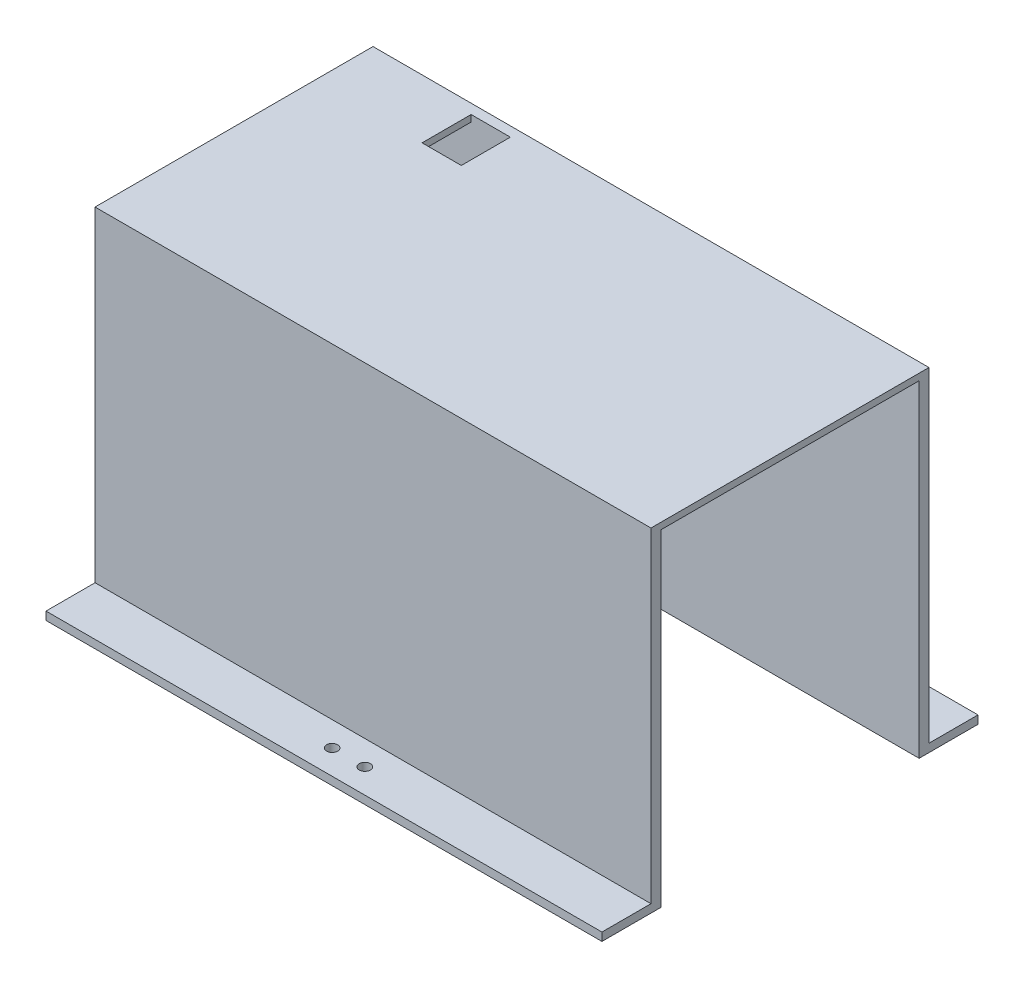
ISO-10303-21;
HEADER;
FILE_DESCRIPTION(('STEP AP214'),'2;1');
FILE_NAME('part.step','',(''),(''),'','','');
FILE_SCHEMA(('AUTOMOTIVE_DESIGN { 1 0 10303 214 1 1 1 1 }'));
ENDSEC;
DATA;
#1=APPLICATION_CONTEXT('core data for automotive mechanical design processes');
#2=APPLICATION_PROTOCOL_DEFINITION('international standard','automotive_design',2000,#1);
#3=PRODUCT_CONTEXT('',#1,'mechanical');
#4=PRODUCT('Part','Part','',(#3));
#5=PRODUCT_RELATED_PRODUCT_CATEGORY('part','',(#4));
#6=PRODUCT_DEFINITION_FORMATION('','',#4);
#7=PRODUCT_DEFINITION_CONTEXT('part definition',#1,'design');
#8=PRODUCT_DEFINITION('design','',#6,#7);
#9=PRODUCT_DEFINITION_SHAPE('','',#8);
#10=(LENGTH_UNIT() NAMED_UNIT(*) SI_UNIT(.MILLI.,.METRE.));
#11=(NAMED_UNIT(*) PLANE_ANGLE_UNIT() SI_UNIT($,.RADIAN.));
#12=(NAMED_UNIT(*) SI_UNIT($,.STERADIAN.) SOLID_ANGLE_UNIT());
#13=UNCERTAINTY_MEASURE_WITH_UNIT(LENGTH_MEASURE(1.E-05),#10,'distance_accuracy_value','');
#14=(GEOMETRIC_REPRESENTATION_CONTEXT(3) GLOBAL_UNCERTAINTY_ASSIGNED_CONTEXT((#13)) GLOBAL_UNIT_ASSIGNED_CONTEXT((#10,
#11,#12)) REPRESENTATION_CONTEXT('',''));
#15=CARTESIAN_POINT('',(0.,0.,0.));
#16=DIRECTION('',(0.,0.,1.));
#17=DIRECTION('',(1.,0.,0.));
#18=AXIS2_PLACEMENT_3D('',#15,#16,#17);
#19=CARTESIAN_POINT('',(-74.5991561181434,2.,45.5485232067511));
#20=DIRECTION('',(0.,0.,-1.));
#21=DIRECTION('',(-1.,0.,0.));
#22=AXIS2_PLACEMENT_3D('',#19,#20,#21);
#23=PLANE('',#22);
#24=DIRECTION('',(-1.,0.,0.));
#25=VECTOR('',#24,1.);
#26=CARTESIAN_POINT('',(-74.5991561181434,-97.5,45.5485232067511));
#27=LINE('',#26,#25);
#28=CARTESIAN_POINT('',(95.4008438818566,-97.5,45.5485232067511));
#29=VERTEX_POINT('',#28);
#30=CARTESIAN_POINT('',(-74.5991561181434,-97.5,45.5485232067511));
#31=VERTEX_POINT('',#30);
#32=EDGE_CURVE('E57',#29,#31,#27,.T.);
#33=ORIENTED_EDGE('',*,*,#32,.F.);
#34=DIRECTION('',(0.,-1.,0.));
#35=VECTOR('',#34,1.);
#36=CARTESIAN_POINT('',(95.4008438818566,2.,45.5485232067511));
#37=LINE('',#36,#35);
#38=CARTESIAN_POINT('',(95.4008438818566,2.,45.5485232067511));
#39=VERTEX_POINT('',#38);
#40=EDGE_CURVE('E278',#39,#29,#37,.T.);
#41=ORIENTED_EDGE('',*,*,#40,.F.);
#42=DIRECTION('',(1.,0.,0.));
#43=VECTOR('',#42,1.);
#44=CARTESIAN_POINT('',(-74.5991561181434,2.,45.5485232067511));
#45=LINE('',#44,#43);
#46=CARTESIAN_POINT('',(-74.5991561181434,2.,45.5485232067511));
#47=VERTEX_POINT('',#46);
#48=EDGE_CURVE('E270',#47,#39,#45,.T.);
#49=ORIENTED_EDGE('',*,*,#48,.F.);
#50=DIRECTION('',(0.,-1.,0.));
#51=VECTOR('',#50,1.);
#52=CARTESIAN_POINT('',(-74.5991561181434,2.,45.5485232067511));
#53=LINE('',#52,#51);
#54=EDGE_CURVE('E43',#47,#31,#53,.T.);
#55=ORIENTED_EDGE('',*,*,#54,.T.);
#56=EDGE_LOOP('',(#33,#41,#49,#55));
#57=FACE_BOUND('',#56,.T.);
#58=ADVANCED_FACE('F39',(#57),#23,.F.);
#59=CARTESIAN_POINT('',(-74.5991561181434,2.,-39.4514767932489));
#60=DIRECTION('',(0.,0.,1.));
#61=DIRECTION('',(1.,0.,0.));
#62=AXIS2_PLACEMENT_3D('',#59,#60,#61);
#63=PLANE('',#62);
#64=DIRECTION('',(1.,0.,0.));
#65=VECTOR('',#64,1.);
#66=CARTESIAN_POINT('',(95.4008438818566,-97.5,-39.4514767932489));
#67=LINE('',#66,#65);
#68=CARTESIAN_POINT('',(-74.5991561181434,-97.5,-39.4514767932489));
#69=VERTEX_POINT('',#68);
#70=CARTESIAN_POINT('',(95.4008438818566,-97.5,-39.4514767932489));
#71=VERTEX_POINT('',#70);
#72=EDGE_CURVE('E63',#69,#71,#67,.T.);
#73=ORIENTED_EDGE('',*,*,#72,.F.);
#74=DIRECTION('',(0.,-1.,0.));
#75=VECTOR('',#74,1.);
#76=CARTESIAN_POINT('',(-74.5991561181434,2.,-39.4514767932489));
#77=LINE('',#76,#75);
#78=CARTESIAN_POINT('',(-74.5991561181434,2.,-39.4514767932489));
#79=VERTEX_POINT('',#78);
#80=EDGE_CURVE('E273',#79,#69,#77,.T.);
#81=ORIENTED_EDGE('',*,*,#80,.F.);
#82=DIRECTION('',(-1.,0.,0.));
#83=VECTOR('',#82,1.);
#84=CARTESIAN_POINT('',(-74.5991561181434,2.,-39.4514767932489));
#85=LINE('',#84,#83);
#86=CARTESIAN_POINT('',(95.4008438818566,2.,-39.4514767932489));
#87=VERTEX_POINT('',#86);
#88=EDGE_CURVE('E275',#87,#79,#85,.T.);
#89=ORIENTED_EDGE('',*,*,#88,.F.);
#90=DIRECTION('',(0.,-1.,0.));
#91=VECTOR('',#90,1.);
#92=CARTESIAN_POINT('',(95.4008438818566,2.,-39.4514767932489));
#93=LINE('',#92,#91);
#94=EDGE_CURVE('E276',#87,#71,#93,.T.);
#95=ORIENTED_EDGE('',*,*,#94,.T.);
#96=EDGE_LOOP('',(#73,#81,#89,#95));
#97=FACE_BOUND('',#96,.T.);
#98=ADVANCED_FACE('F330',(#97),#63,.F.);
#99=CARTESIAN_POINT('',(0.,0.,0.));
#100=DIRECTION('',(0.,1.,0.));
#101=DIRECTION('',(0.,0.,1.));
#102=AXIS2_PLACEMENT_3D('',#99,#100,#101);
#103=PLANE('',#102);
#104=DIRECTION('',(-1.,0.,0.));
#105=VECTOR('',#104,1.);
#106=CARTESIAN_POINT('',(-74.5991561181434,0.,-36.4514767932489));
#107=LINE('',#106,#105);
#108=CARTESIAN_POINT('',(95.4008438818566,0.,-36.4514767932489));
#109=VERTEX_POINT('',#108);
#110=CARTESIAN_POINT('',(-29.5991561181434,0.,-36.4514767932489));
#111=VERTEX_POINT('',#110);
#112=EDGE_CURVE('E47',#109,#111,#107,.T.);
#113=ORIENTED_EDGE('',*,*,#112,.F.);
#114=DIRECTION('',(0.,0.,-1.));
#115=VECTOR('',#114,1.);
#116=CARTESIAN_POINT('',(95.4008438818566,0.,-39.4514767932489));
#117=LINE('',#116,#115);
#118=CARTESIAN_POINT('',(95.4008438818566,0.,42.5485232067511));
#119=VERTEX_POINT('',#118);
#120=EDGE_CURVE('E268',#119,#109,#117,.T.);
#121=ORIENTED_EDGE('',*,*,#120,.F.);
#122=DIRECTION('',(1.,0.,0.));
#123=VECTOR('',#122,1.);
#124=CARTESIAN_POINT('',(-74.5991561181434,0.,42.5485232067511));
#125=LINE('',#124,#123);
#126=CARTESIAN_POINT('',(-74.5991561181434,0.,42.5485232067511));
#127=VERTEX_POINT('',#126);
#128=EDGE_CURVE('E167',#127,#119,#125,.T.);
#129=ORIENTED_EDGE('',*,*,#128,.F.);
#130=DIRECTION('',(0.,0.,1.));
#131=VECTOR('',#130,1.);
#132=CARTESIAN_POINT('',(-74.5991561181434,0.,-39.4514767932489));
#133=LINE('',#132,#131);
#134=CARTESIAN_POINT('',(-74.5991561181434,0.,-36.4514767932489));
#135=VERTEX_POINT('',#134);
#136=EDGE_CURVE('E260',#135,#127,#133,.T.);
#137=ORIENTED_EDGE('',*,*,#136,.F.);
#138=CARTESIAN_POINT('',(-41.5991561181434,0.,-36.4514767932489));
#139=VERTEX_POINT('',#138);
#140=EDGE_CURVE('E11',#139,#135,#107,.T.);
#141=ORIENTED_EDGE('',*,*,#140,.F.);
#142=DIRECTION('',(0.,0.,1.));
#143=VECTOR('',#142,1.);
#144=CARTESIAN_POINT('',(-41.5991561181434,0.,-36.4514767932489));
#145=LINE('',#144,#143);
#146=CARTESIAN_POINT('',(-41.5991561181434,0.,-21.4514767932489));
#147=VERTEX_POINT('',#146);
#148=EDGE_CURVE('E234',#139,#147,#145,.T.);
#149=ORIENTED_EDGE('',*,*,#148,.T.);
#150=DIRECTION('',(1.,0.,0.));
#151=VECTOR('',#150,1.);
#152=CARTESIAN_POINT('',(-41.5991561181434,0.,-21.4514767932489));
#153=LINE('',#152,#151);
#154=CARTESIAN_POINT('',(-29.5991561181434,0.,-21.4514767932489));
#155=VERTEX_POINT('',#154);
#156=EDGE_CURVE('E236',#147,#155,#153,.T.);
#157=ORIENTED_EDGE('',*,*,#156,.T.);
#158=DIRECTION('',(0.,0.,-1.));
#159=VECTOR('',#158,1.);
#160=CARTESIAN_POINT('',(-29.5991561181434,0.,-36.4514767932489));
#161=LINE('',#160,#159);
#162=EDGE_CURVE('E245',#155,#111,#161,.T.);
#163=ORIENTED_EDGE('',*,*,#162,.T.);
#164=EDGE_LOOP('',(#113,#121,#129,#137,#141,#149,#157,#163));
#165=FACE_BOUND('',#164,.T.);
#166=ADVANCED_FACE('F294',(#165),#103,.F.);
#167=CARTESIAN_POINT('',(-74.5991561181434,2.,-39.4514767932489));
#168=DIRECTION('',(1.,0.,0.));
#169=DIRECTION('',(0.,0.,-1.));
#170=AXIS2_PLACEMENT_3D('',#167,#168,#169);
#171=PLANE('',#170);
#172=ORIENTED_EDGE('',*,*,#80,.T.);
#173=DIRECTION('',(0.,0.,1.));
#174=VECTOR('',#173,1.);
#175=CARTESIAN_POINT('',(-74.5991561181434,-97.5,-54.4514767932489));
#176=LINE('',#175,#174);
#177=CARTESIAN_POINT('',(-74.5991561181434,-97.5,-54.4514767932489));
#178=VERTEX_POINT('',#177);
#179=EDGE_CURVE('E209',#178,#69,#176,.T.);
#180=ORIENTED_EDGE('',*,*,#179,.F.);
#181=DIRECTION('',(0.,1.,0.));
#182=VECTOR('',#181,1.);
#183=CARTESIAN_POINT('',(-74.5991561181434,-100.,-54.4514767932489));
#184=LINE('',#183,#182);
#185=CARTESIAN_POINT('',(-74.5991561181434,-100.,-54.4514767932489));
#186=VERTEX_POINT('',#185);
#187=EDGE_CURVE('E205',#186,#178,#184,.T.);
#188=ORIENTED_EDGE('',*,*,#187,.F.);
#189=DIRECTION('',(0.,0.,-1.));
#190=VECTOR('',#189,1.);
#191=CARTESIAN_POINT('',(-74.5991561181434,-100.,-39.4514767932489));
#192=LINE('',#191,#190);
#193=CARTESIAN_POINT('',(-74.5991561181434,-100.,-36.4514767932489));
#194=VERTEX_POINT('',#193);
#195=EDGE_CURVE('E213',#194,#186,#192,.T.);
#196=ORIENTED_EDGE('',*,*,#195,.F.);
#197=DIRECTION('',(0.,1.,0.));
#198=VECTOR('',#197,1.);
#199=CARTESIAN_POINT('',(-74.5991561181434,-100.,-36.4514767932489));
#200=LINE('',#199,#198);
#201=EDGE_CURVE('E217',#194,#135,#200,.T.);
#202=ORIENTED_EDGE('',*,*,#201,.T.);
#203=ORIENTED_EDGE('',*,*,#136,.T.);
#204=DIRECTION('',(0.,1.,0.));
#205=VECTOR('',#204,1.);
#206=CARTESIAN_POINT('',(-74.5991561181434,-100.,42.5485232067511));
#207=LINE('',#206,#205);
#208=CARTESIAN_POINT('',(-74.5991561181434,-100.,42.5485232067511));
#209=VERTEX_POINT('',#208);
#210=EDGE_CURVE('E163',#209,#127,#207,.T.);
#211=ORIENTED_EDGE('',*,*,#210,.F.);
#212=DIRECTION('',(0.,0.,-1.));
#213=VECTOR('',#212,1.);
#214=CARTESIAN_POINT('',(-74.5991561181434,-100.,45.5485232067511));
#215=LINE('',#214,#213);
#216=CARTESIAN_POINT('',(-74.5991561181434,-100.,60.5485232067511));
#217=VERTEX_POINT('',#216);
#218=EDGE_CURVE('E160',#217,#209,#215,.T.);
#219=ORIENTED_EDGE('',*,*,#218,.F.);
#220=DIRECTION('',(0.,-1.,0.));
#221=VECTOR('',#220,1.);
#222=CARTESIAN_POINT('',(-74.5991561181434,-100.,60.5485232067511));
#223=LINE('',#222,#221);
#224=CARTESIAN_POINT('',(-74.5991561181434,-97.5,60.5485232067511));
#225=VERTEX_POINT('',#224);
#226=EDGE_CURVE('E161',#225,#217,#223,.T.);
#227=ORIENTED_EDGE('',*,*,#226,.F.);
#228=DIRECTION('',(0.,0.,-1.));
#229=VECTOR('',#228,1.);
#230=CARTESIAN_POINT('',(-74.5991561181434,-97.5,60.5485232067511));
#231=LINE('',#230,#229);
#232=EDGE_CURVE('E189',#225,#31,#231,.T.);
#233=ORIENTED_EDGE('',*,*,#232,.T.);
#234=ORIENTED_EDGE('',*,*,#54,.F.);
#235=DIRECTION('',(0.,0.,1.));
#236=VECTOR('',#235,1.);
#237=CARTESIAN_POINT('',(-74.5991561181434,2.,-39.4514767932489));
#238=LINE('',#237,#236);
#239=EDGE_CURVE('E262',#79,#47,#238,.T.);
#240=ORIENTED_EDGE('',*,*,#239,.F.);
#241=EDGE_LOOP('',(#172,#180,#188,#196,#202,#203,#211,#219,#227,#233,#234,#240));
#242=FACE_BOUND('',#241,.T.);
#243=ADVANCED_FACE('F41',(#242),#171,.F.);
#244=CARTESIAN_POINT('',(95.4008438818566,2.,-39.4514767932489));
#245=DIRECTION('',(-1.,0.,0.));
#246=DIRECTION('',(0.,0.,1.));
#247=AXIS2_PLACEMENT_3D('',#244,#245,#246);
#248=PLANE('',#247);
#249=ORIENTED_EDGE('',*,*,#40,.T.);
#250=DIRECTION('',(0.,0.,-1.));
#251=VECTOR('',#250,1.);
#252=CARTESIAN_POINT('',(95.4008438818566,-97.5,60.5485232067511));
#253=LINE('',#252,#251);
#254=CARTESIAN_POINT('',(95.4008438818566,-97.5,60.5485232067511));
#255=VERTEX_POINT('',#254);
#256=EDGE_CURVE('E192',#255,#29,#253,.T.);
#257=ORIENTED_EDGE('',*,*,#256,.F.);
#258=DIRECTION('',(0.,1.,0.));
#259=VECTOR('',#258,1.);
#260=CARTESIAN_POINT('',(95.4008438818566,-100.,60.5485232067511));
#261=LINE('',#260,#259);
#262=CARTESIAN_POINT('',(95.4008438818566,-100.,60.5485232067511));
#263=VERTEX_POINT('',#262);
#264=EDGE_CURVE('E176',#263,#255,#261,.T.);
#265=ORIENTED_EDGE('',*,*,#264,.F.);
#266=DIRECTION('',(0.,0.,1.));
#267=VECTOR('',#266,1.);
#268=CARTESIAN_POINT('',(95.4008438818566,-100.,45.5485232067511));
#269=LINE('',#268,#267);
#270=CARTESIAN_POINT('',(95.4008438818566,-100.,42.5485232067511));
#271=VERTEX_POINT('',#270);
#272=EDGE_CURVE('E172',#271,#263,#269,.T.);
#273=ORIENTED_EDGE('',*,*,#272,.F.);
#274=DIRECTION('',(0.,1.,0.));
#275=VECTOR('',#274,1.);
#276=CARTESIAN_POINT('',(95.4008438818566,-100.,42.5485232067511));
#277=LINE('',#276,#275);
#278=EDGE_CURVE('E227',#271,#119,#277,.T.);
#279=ORIENTED_EDGE('',*,*,#278,.T.);
#280=ORIENTED_EDGE('',*,*,#120,.T.);
#281=DIRECTION('',(0.,1.,0.));
#282=VECTOR('',#281,1.);
#283=CARTESIAN_POINT('',(95.4008438818566,-100.,-36.4514767932489));
#284=LINE('',#283,#282);
#285=CARTESIAN_POINT('',(95.4008438818566,-100.,-36.4514767932489));
#286=VERTEX_POINT('',#285);
#287=EDGE_CURVE('E224',#286,#109,#284,.T.);
#288=ORIENTED_EDGE('',*,*,#287,.F.);
#289=DIRECTION('',(0.,0.,1.));
#290=VECTOR('',#289,1.);
#291=CARTESIAN_POINT('',(95.4008438818566,-100.,-39.4514767932489));
#292=LINE('',#291,#290);
#293=CARTESIAN_POINT('',(95.4008438818566,-100.,-54.4514767932489));
#294=VERTEX_POINT('',#293);
#295=EDGE_CURVE('E214',#294,#286,#292,.T.);
#296=ORIENTED_EDGE('',*,*,#295,.F.);
#297=DIRECTION('',(0.,-1.,0.));
#298=VECTOR('',#297,1.);
#299=CARTESIAN_POINT('',(95.4008438818566,-100.,-54.4514767932489));
#300=LINE('',#299,#298);
#301=CARTESIAN_POINT('',(95.4008438818566,-97.5,-54.4514767932489));
#302=VERTEX_POINT('',#301);
#303=EDGE_CURVE('E198',#302,#294,#300,.T.);
#304=ORIENTED_EDGE('',*,*,#303,.F.);
#305=DIRECTION('',(0.,0.,1.));
#306=VECTOR('',#305,1.);
#307=CARTESIAN_POINT('',(95.4008438818566,-97.5,-54.4514767932489));
#308=LINE('',#307,#306);
#309=EDGE_CURVE('E206',#302,#71,#308,.T.);
#310=ORIENTED_EDGE('',*,*,#309,.T.);
#311=ORIENTED_EDGE('',*,*,#94,.F.);
#312=DIRECTION('',(0.,0.,-1.));
#313=VECTOR('',#312,1.);
#314=CARTESIAN_POINT('',(95.4008438818566,2.,-39.4514767932489));
#315=LINE('',#314,#313);
#316=EDGE_CURVE('E269',#39,#87,#315,.T.);
#317=ORIENTED_EDGE('',*,*,#316,.F.);
#318=EDGE_LOOP('',(#249,#257,#265,#273,#279,#280,#288,#296,#304,#310,#311,#317));
#319=FACE_BOUND('',#318,.T.);
#320=ADVANCED_FACE('F287',(#319),#248,.F.);
#321=CARTESIAN_POINT('',(0.,2.,0.));
#322=DIRECTION('',(0.,1.,0.));
#323=DIRECTION('',(0.,0.,1.));
#324=AXIS2_PLACEMENT_3D('',#321,#322,#323);
#325=PLANE('',#324);
#326=DIRECTION('',(-1.,0.,0.));
#327=VECTOR('',#326,1.);
#328=CARTESIAN_POINT('',(-41.5991561181434,2.,-36.4514767932489));
#329=LINE('',#328,#327);
#330=CARTESIAN_POINT('',(-29.5991561181434,2.,-36.4514767932489));
#331=VERTEX_POINT('',#330);
#332=CARTESIAN_POINT('',(-41.5991561181434,2.,-36.4514767932489));
#333=VERTEX_POINT('',#332);
#334=EDGE_CURVE('E226',#331,#333,#329,.T.);
#335=ORIENTED_EDGE('',*,*,#334,.F.);
#336=DIRECTION('',(0.,0.,-1.));
#337=VECTOR('',#336,1.);
#338=CARTESIAN_POINT('',(-29.5991561181434,2.,-36.4514767932489));
#339=LINE('',#338,#337);
#340=CARTESIAN_POINT('',(-29.5991561181434,2.,-21.4514767932489));
#341=VERTEX_POINT('',#340);
#342=EDGE_CURVE('E239',#341,#331,#339,.T.);
#343=ORIENTED_EDGE('',*,*,#342,.F.);
#344=DIRECTION('',(1.,0.,0.));
#345=VECTOR('',#344,1.);
#346=CARTESIAN_POINT('',(-41.5991561181434,2.,-21.4514767932489));
#347=LINE('',#346,#345);
#348=CARTESIAN_POINT('',(-41.5991561181434,2.,-21.4514767932489));
#349=VERTEX_POINT('',#348);
#350=EDGE_CURVE('E249',#349,#341,#347,.T.);
#351=ORIENTED_EDGE('',*,*,#350,.F.);
#352=DIRECTION('',(0.,0.,1.));
#353=VECTOR('',#352,1.);
#354=CARTESIAN_POINT('',(-41.5991561181434,2.,-36.4514767932489));
#355=LINE('',#354,#353);
#356=EDGE_CURVE('E250',#333,#349,#355,.T.);
#357=ORIENTED_EDGE('',*,*,#356,.F.);
#358=EDGE_LOOP('',(#335,#343,#351,#357));
#359=FACE_BOUND('',#358,.T.);
#360=ORIENTED_EDGE('',*,*,#239,.T.);
#361=ORIENTED_EDGE('',*,*,#48,.T.);
#362=ORIENTED_EDGE('',*,*,#316,.T.);
#363=ORIENTED_EDGE('',*,*,#88,.T.);
#364=EDGE_LOOP('',(#360,#361,#362,#363));
#365=FACE_BOUND('',#364,.T.);
#366=ADVANCED_FACE('F328',(#359,#365),#325,.T.);
#367=CARTESIAN_POINT('',(-41.5991561181434,0.,-36.4514767932489));
#368=DIRECTION('',(0.,0.,-1.));
#369=DIRECTION('',(-1.,0.,0.));
#370=AXIS2_PLACEMENT_3D('',#367,#368,#369);
#371=PLANE('',#370);
#372=ORIENTED_EDGE('',*,*,#334,.T.);
#373=DIRECTION('',(0.,1.,0.));
#374=VECTOR('',#373,1.);
#375=CARTESIAN_POINT('',(-41.5991561181434,0.,-36.4514767932489));
#376=LINE('',#375,#374);
#377=EDGE_CURVE('E244',#139,#333,#376,.T.);
#378=ORIENTED_EDGE('',*,*,#377,.F.);
#379=ORIENTED_EDGE('',*,*,#140,.T.);
#380=ORIENTED_EDGE('',*,*,#201,.F.);
#381=DIRECTION('',(-1.,0.,0.));
#382=VECTOR('',#381,1.);
#383=CARTESIAN_POINT('',(-74.5991561181434,-100.,-36.4514767932489));
#384=LINE('',#383,#382);
#385=EDGE_CURVE('E220',#286,#194,#384,.T.);
#386=ORIENTED_EDGE('',*,*,#385,.F.);
#387=ORIENTED_EDGE('',*,*,#287,.T.);
#388=ORIENTED_EDGE('',*,*,#112,.T.);
#389=DIRECTION('',(0.,1.,0.));
#390=VECTOR('',#389,1.);
#391=CARTESIAN_POINT('',(-29.5991561181434,0.,-36.4514767932489));
#392=LINE('',#391,#390);
#393=EDGE_CURVE('E254',#111,#331,#392,.T.);
#394=ORIENTED_EDGE('',*,*,#393,.T.);
#395=EDGE_LOOP('',(#372,#378,#379,#380,#386,#387,#388,#394));
#396=FACE_BOUND('',#395,.T.);
#397=ADVANCED_FACE('F299',(#396),#371,.F.);
#398=CARTESIAN_POINT('',(-29.5991561181434,0.,-36.4514767932489));
#399=DIRECTION('',(1.,0.,0.));
#400=DIRECTION('',(0.,0.,-1.));
#401=AXIS2_PLACEMENT_3D('',#398,#399,#400);
#402=PLANE('',#401);
#403=ORIENTED_EDGE('',*,*,#342,.T.);
#404=ORIENTED_EDGE('',*,*,#393,.F.);
#405=ORIENTED_EDGE('',*,*,#162,.F.);
#406=DIRECTION('',(0.,1.,0.));
#407=VECTOR('',#406,1.);
#408=CARTESIAN_POINT('',(-29.5991561181434,0.,-21.4514767932489));
#409=LINE('',#408,#407);
#410=EDGE_CURVE('E256',#155,#341,#409,.T.);
#411=ORIENTED_EDGE('',*,*,#410,.T.);
#412=EDGE_LOOP('',(#403,#404,#405,#411));
#413=FACE_BOUND('',#412,.T.);
#414=ADVANCED_FACE('F311',(#413),#402,.F.);
#415=CARTESIAN_POINT('',(-41.5991561181434,0.,-21.4514767932489));
#416=DIRECTION('',(0.,0.,1.));
#417=DIRECTION('',(1.,0.,0.));
#418=AXIS2_PLACEMENT_3D('',#415,#416,#417);
#419=PLANE('',#418);
#420=ORIENTED_EDGE('',*,*,#350,.T.);
#421=ORIENTED_EDGE('',*,*,#410,.F.);
#422=ORIENTED_EDGE('',*,*,#156,.F.);
#423=DIRECTION('',(0.,1.,0.));
#424=VECTOR('',#423,1.);
#425=CARTESIAN_POINT('',(-41.5991561181434,0.,-21.4514767932489));
#426=LINE('',#425,#424);
#427=EDGE_CURVE('E257',#147,#349,#426,.T.);
#428=ORIENTED_EDGE('',*,*,#427,.T.);
#429=EDGE_LOOP('',(#420,#421,#422,#428));
#430=FACE_BOUND('',#429,.T.);
#431=ADVANCED_FACE('F310',(#430),#419,.F.);
#432=CARTESIAN_POINT('',(-41.5991561181434,0.,-36.4514767932489));
#433=DIRECTION('',(-1.,0.,0.));
#434=DIRECTION('',(0.,0.,1.));
#435=AXIS2_PLACEMENT_3D('',#432,#433,#434);
#436=PLANE('',#435);
#437=ORIENTED_EDGE('',*,*,#356,.T.);
#438=ORIENTED_EDGE('',*,*,#427,.F.);
#439=ORIENTED_EDGE('',*,*,#148,.F.);
#440=ORIENTED_EDGE('',*,*,#377,.T.);
#441=EDGE_LOOP('',(#437,#438,#439,#440));
#442=FACE_BOUND('',#441,.T.);
#443=ADVANCED_FACE('F304',(#442),#436,.F.);
#444=CARTESIAN_POINT('',(-74.5991561181434,-100.,42.5485232067511));
#445=DIRECTION('',(0.,0.,1.));
#446=DIRECTION('',(1.,0.,0.));
#447=AXIS2_PLACEMENT_3D('',#444,#445,#446);
#448=PLANE('',#447);
#449=ORIENTED_EDGE('',*,*,#128,.T.);
#450=ORIENTED_EDGE('',*,*,#278,.F.);
#451=DIRECTION('',(1.,0.,0.));
#452=VECTOR('',#451,1.);
#453=CARTESIAN_POINT('',(-74.5991561181434,-100.,42.5485232067511));
#454=LINE('',#453,#452);
#455=EDGE_CURVE('E170',#209,#271,#454,.T.);
#456=ORIENTED_EDGE('',*,*,#455,.F.);
#457=ORIENTED_EDGE('',*,*,#210,.T.);
#458=EDGE_LOOP('',(#449,#450,#456,#457));
#459=FACE_BOUND('',#458,.T.);
#460=ADVANCED_FACE('F295',(#459),#448,.F.);
#461=CARTESIAN_POINT('',(0.,-100.,0.));
#462=DIRECTION('',(0.,-1.,0.));
#463=DIRECTION('',(0.,0.,-1.));
#464=AXIS2_PLACEMENT_3D('',#461,#462,#463);
#465=PLANE('',#464);
#466=CARTESIAN_POINT('',(5.40084388185659,-100.,53.0485232067511));
#467=DIRECTION('',(0.,1.,0.));
#468=DIRECTION('',(0.,0.,1.));
#469=AXIS2_PLACEMENT_3D('',#466,#467,#468);
#470=CIRCLE('',#469,1.7);
#471=CARTESIAN_POINT('',(5.40084388185659,-100.,54.7485232067511));
#472=VERTEX_POINT('',#471);
#473=EDGE_CURVE('E181',#472,#472,#470,.T.);
#474=ORIENTED_EDGE('',*,*,#473,.T.);
#475=EDGE_LOOP('',(#474));
#476=FACE_BOUND('',#475,.T.);
#477=CARTESIAN_POINT('',(15.4008438818566,-100.,53.0485232067511));
#478=DIRECTION('',(0.,1.,0.));
#479=DIRECTION('',(0.,0.,1.));
#480=AXIS2_PLACEMENT_3D('',#477,#478,#479);
#481=CIRCLE('',#480,1.7);
#482=CARTESIAN_POINT('',(15.4008438818566,-100.,54.7485232067511));
#483=VERTEX_POINT('',#482);
#484=EDGE_CURVE('E186',#483,#483,#481,.T.);
#485=ORIENTED_EDGE('',*,*,#484,.T.);
#486=EDGE_LOOP('',(#485));
#487=FACE_BOUND('',#486,.T.);
#488=ORIENTED_EDGE('',*,*,#218,.T.);
#489=ORIENTED_EDGE('',*,*,#455,.T.);
#490=ORIENTED_EDGE('',*,*,#272,.T.);
#491=DIRECTION('',(1.,0.,0.));
#492=VECTOR('',#491,1.);
#493=CARTESIAN_POINT('',(-74.5991561181434,-100.,60.5485232067511));
#494=LINE('',#493,#492);
#495=EDGE_CURVE('E168',#217,#263,#494,.T.);
#496=ORIENTED_EDGE('',*,*,#495,.F.);
#497=EDGE_LOOP('',(#488,#489,#490,#496));
#498=FACE_BOUND('',#497,.T.);
#499=ADVANCED_FACE('F171',(#476,#487,#498),#465,.T.);
#500=CARTESIAN_POINT('',(0.,-100.,0.));
#501=DIRECTION('',(0.,1.,0.));
#502=DIRECTION('',(0.,0.,1.));
#503=AXIS2_PLACEMENT_3D('',#500,#501,#502);
#504=PLANE('',#503);
#505=CARTESIAN_POINT('',(5.40084388185656,-100.,-46.9514767932489));
#506=DIRECTION('',(0.,1.,0.));
#507=DIRECTION('',(0.,0.,1.));
#508=AXIS2_PLACEMENT_3D('',#505,#506,#507);
#509=CIRCLE('',#508,1.7);
#510=CARTESIAN_POINT('',(5.40084388185656,-100.,-45.2514767932489));
#511=VERTEX_POINT('',#510);
#512=EDGE_CURVE('E555',#511,#511,#509,.T.);
#513=ORIENTED_EDGE('',*,*,#512,.T.);
#514=EDGE_LOOP('',(#513));
#515=FACE_BOUND('',#514,.T.);
#516=CARTESIAN_POINT('',(15.4008438818566,-100.,-46.9514767932489));
#517=DIRECTION('',(0.,1.,0.));
#518=DIRECTION('',(0.,0.,1.));
#519=AXIS2_PLACEMENT_3D('',#516,#517,#518);
#520=CIRCLE('',#519,1.7);
#521=CARTESIAN_POINT('',(15.4008438818566,-100.,-45.2514767932489));
#522=VERTEX_POINT('',#521);
#523=EDGE_CURVE('E559',#522,#522,#520,.T.);
#524=ORIENTED_EDGE('',*,*,#523,.T.);
#525=EDGE_LOOP('',(#524));
#526=FACE_BOUND('',#525,.T.);
#527=ORIENTED_EDGE('',*,*,#195,.T.);
#528=DIRECTION('',(-1.,0.,0.));
#529=VECTOR('',#528,1.);
#530=CARTESIAN_POINT('',(95.4008438818566,-100.,-54.4514767932489));
#531=LINE('',#530,#529);
#532=EDGE_CURVE('E200',#294,#186,#531,.T.);
#533=ORIENTED_EDGE('',*,*,#532,.F.);
#534=ORIENTED_EDGE('',*,*,#295,.T.);
#535=ORIENTED_EDGE('',*,*,#385,.T.);
#536=EDGE_LOOP('',(#527,#533,#534,#535));
#537=FACE_BOUND('',#536,.T.);
#538=ADVANCED_FACE('F320',(#515,#526,#537),#504,.F.);
#539=CARTESIAN_POINT('',(95.4008438818566,-97.5,-54.4514767932489));
#540=DIRECTION('',(0.,-1.,0.));
#541=DIRECTION('',(0.,0.,-1.));
#542=AXIS2_PLACEMENT_3D('',#539,#540,#541);
#543=PLANE('',#542);
#544=CARTESIAN_POINT('',(5.40084388185656,-97.5,-46.9514767932489));
#545=DIRECTION('',(0.,1.,0.));
#546=DIRECTION('',(0.,0.,1.));
#547=AXIS2_PLACEMENT_3D('',#544,#545,#546);
#548=CIRCLE('',#547,1.7);
#549=CARTESIAN_POINT('',(5.40084388185656,-97.5,-45.2514767932489));
#550=VERTEX_POINT('',#549);
#551=EDGE_CURVE('E553',#550,#550,#548,.T.);
#552=ORIENTED_EDGE('',*,*,#551,.F.);
#553=EDGE_LOOP('',(#552));
#554=FACE_BOUND('',#553,.T.);
#555=CARTESIAN_POINT('',(15.4008438818566,-97.5,-46.9514767932489));
#556=DIRECTION('',(0.,1.,0.));
#557=DIRECTION('',(0.,0.,1.));
#558=AXIS2_PLACEMENT_3D('',#555,#556,#557);
#559=CIRCLE('',#558,1.7);
#560=CARTESIAN_POINT('',(15.4008438818566,-97.5,-45.2514767932489));
#561=VERTEX_POINT('',#560);
#562=EDGE_CURVE('E556',#561,#561,#559,.T.);
#563=ORIENTED_EDGE('',*,*,#562,.F.);
#564=EDGE_LOOP('',(#563));
#565=FACE_BOUND('',#564,.T.);
#566=ORIENTED_EDGE('',*,*,#72,.T.);
#567=ORIENTED_EDGE('',*,*,#309,.F.);
#568=DIRECTION('',(1.,0.,0.));
#569=VECTOR('',#568,1.);
#570=CARTESIAN_POINT('',(95.4008438818566,-97.5,-54.4514767932489));
#571=LINE('',#570,#569);
#572=EDGE_CURVE('E204',#178,#302,#571,.T.);
#573=ORIENTED_EDGE('',*,*,#572,.F.);
#574=ORIENTED_EDGE('',*,*,#179,.T.);
#575=EDGE_LOOP('',(#566,#567,#573,#574));
#576=FACE_BOUND('',#575,.T.);
#577=ADVANCED_FACE('F322',(#554,#565,#576),#543,.F.);
#578=CARTESIAN_POINT('',(0.,0.,-54.4514767932489));
#579=DIRECTION('',(0.,0.,1.));
#580=DIRECTION('',(1.,0.,0.));
#581=AXIS2_PLACEMENT_3D('',#578,#579,#580);
#582=PLANE('',#581);
#583=ORIENTED_EDGE('',*,*,#303,.T.);
#584=ORIENTED_EDGE('',*,*,#532,.T.);
#585=ORIENTED_EDGE('',*,*,#187,.T.);
#586=ORIENTED_EDGE('',*,*,#572,.T.);
#587=EDGE_LOOP('',(#583,#584,#585,#586));
#588=FACE_BOUND('',#587,.T.);
#589=ADVANCED_FACE('F317',(#588),#582,.F.);
#590=CARTESIAN_POINT('',(-74.5991561181434,-97.5,60.5485232067511));
#591=DIRECTION('',(0.,-1.,0.));
#592=DIRECTION('',(0.,0.,-1.));
#593=AXIS2_PLACEMENT_3D('',#590,#591,#592);
#594=PLANE('',#593);
#595=CARTESIAN_POINT('',(5.40084388185659,-97.5,53.0485232067511));
#596=DIRECTION('',(0.,1.,0.));
#597=DIRECTION('',(0.,0.,1.));
#598=AXIS2_PLACEMENT_3D('',#595,#596,#597);
#599=CIRCLE('',#598,1.7);
#600=CARTESIAN_POINT('',(5.40084388185659,-97.5,54.7485232067511));
#601=VERTEX_POINT('',#600);
#602=EDGE_CURVE('E570',#601,#601,#599,.T.);
#603=ORIENTED_EDGE('',*,*,#602,.F.);
#604=EDGE_LOOP('',(#603));
#605=FACE_BOUND('',#604,.T.);
#606=CARTESIAN_POINT('',(15.4008438818566,-97.5,53.0485232067511));
#607=DIRECTION('',(0.,1.,0.));
#608=DIRECTION('',(0.,0.,1.));
#609=AXIS2_PLACEMENT_3D('',#606,#607,#608);
#610=CIRCLE('',#609,1.7);
#611=CARTESIAN_POINT('',(15.4008438818566,-97.5,54.7485232067511));
#612=VERTEX_POINT('',#611);
#613=EDGE_CURVE('E569',#612,#612,#610,.T.);
#614=ORIENTED_EDGE('',*,*,#613,.F.);
#615=EDGE_LOOP('',(#614));
#616=FACE_BOUND('',#615,.T.);
#617=ORIENTED_EDGE('',*,*,#32,.T.);
#618=ORIENTED_EDGE('',*,*,#232,.F.);
#619=DIRECTION('',(-1.,0.,0.));
#620=VECTOR('',#619,1.);
#621=CARTESIAN_POINT('',(-74.5991561181434,-97.5,60.5485232067511));
#622=LINE('',#621,#620);
#623=EDGE_CURVE('E179',#255,#225,#622,.T.);
#624=ORIENTED_EDGE('',*,*,#623,.F.);
#625=ORIENTED_EDGE('',*,*,#256,.T.);
#626=EDGE_LOOP('',(#617,#618,#624,#625));
#627=FACE_BOUND('',#626,.T.);
#628=ADVANCED_FACE('F290',(#605,#616,#627),#594,.F.);
#629=CARTESIAN_POINT('',(0.,0.,60.5485232067511));
#630=DIRECTION('',(0.,0.,-1.));
#631=DIRECTION('',(-1.,0.,0.));
#632=AXIS2_PLACEMENT_3D('',#629,#630,#631);
#633=PLANE('',#632);
#634=ORIENTED_EDGE('',*,*,#226,.T.);
#635=ORIENTED_EDGE('',*,*,#495,.T.);
#636=ORIENTED_EDGE('',*,*,#264,.T.);
#637=ORIENTED_EDGE('',*,*,#623,.T.);
#638=EDGE_LOOP('',(#634,#635,#636,#637));
#639=FACE_BOUND('',#638,.T.);
#640=ADVANCED_FACE('F177',(#639),#633,.F.);
#641=CARTESIAN_POINT('',(15.4008438818566,-100.,53.0485232067511));
#642=DIRECTION('',(0.,1.,0.));
#643=DIRECTION('',(0.,0.,1.));
#644=AXIS2_PLACEMENT_3D('',#641,#642,#643);
#645=CYLINDRICAL_SURFACE('',#644,1.7);
#646=ORIENTED_EDGE('',*,*,#484,.F.);
#647=EDGE_LOOP('',(#646));
#648=FACE_BOUND('',#647,.T.);
#649=ORIENTED_EDGE('',*,*,#613,.T.);
#650=EDGE_LOOP('',(#649));
#651=FACE_BOUND('',#650,.T.);
#652=ADVANCED_FACE('F366',(#648,#651),#645,.F.);
#653=CARTESIAN_POINT('',(5.40084388185659,-100.,53.0485232067511));
#654=DIRECTION('',(0.,1.,0.));
#655=DIRECTION('',(0.,0.,1.));
#656=AXIS2_PLACEMENT_3D('',#653,#654,#655);
#657=CYLINDRICAL_SURFACE('',#656,1.7);
#658=ORIENTED_EDGE('',*,*,#473,.F.);
#659=EDGE_LOOP('',(#658));
#660=FACE_BOUND('',#659,.T.);
#661=ORIENTED_EDGE('',*,*,#602,.T.);
#662=EDGE_LOOP('',(#661));
#663=FACE_BOUND('',#662,.T.);
#664=ADVANCED_FACE('F391',(#660,#663),#657,.F.);
#665=CARTESIAN_POINT('',(15.4008438818566,-100.,-46.9514767932489));
#666=DIRECTION('',(0.,1.,0.));
#667=DIRECTION('',(0.,0.,1.));
#668=AXIS2_PLACEMENT_3D('',#665,#666,#667);
#669=CYLINDRICAL_SURFACE('',#668,1.7);
#670=ORIENTED_EDGE('',*,*,#523,.F.);
#671=EDGE_LOOP('',(#670));
#672=FACE_BOUND('',#671,.T.);
#673=ORIENTED_EDGE('',*,*,#562,.T.);
#674=EDGE_LOOP('',(#673));
#675=FACE_BOUND('',#674,.T.);
#676=ADVANCED_FACE('F399',(#672,#675),#669,.F.);
#677=CARTESIAN_POINT('',(5.40084388185656,-100.,-46.9514767932489));
#678=DIRECTION('',(0.,1.,0.));
#679=DIRECTION('',(0.,0.,1.));
#680=AXIS2_PLACEMENT_3D('',#677,#678,#679);
#681=CYLINDRICAL_SURFACE('',#680,1.7);
#682=ORIENTED_EDGE('',*,*,#512,.F.);
#683=EDGE_LOOP('',(#682));
#684=FACE_BOUND('',#683,.T.);
#685=ORIENTED_EDGE('',*,*,#551,.T.);
#686=EDGE_LOOP('',(#685));
#687=FACE_BOUND('',#686,.T.);
#688=ADVANCED_FACE('F426',(#684,#687),#681,.F.);
#689=CLOSED_SHELL('',(#58,#98,#166,#243,#320,#366,#397,#414,#431,#443,#460,#499,#538,#577,#589,
#628,#640,#652,#664,#676,#688));
#690=MANIFOLD_SOLID_BREP('B2',#689);
#691=ADVANCED_BREP_SHAPE_REPRESENTATION('',(#18,#690),#14);
#692=SHAPE_DEFINITION_REPRESENTATION(#9,#691);
ENDSEC;
END-ISO-10303-21;
